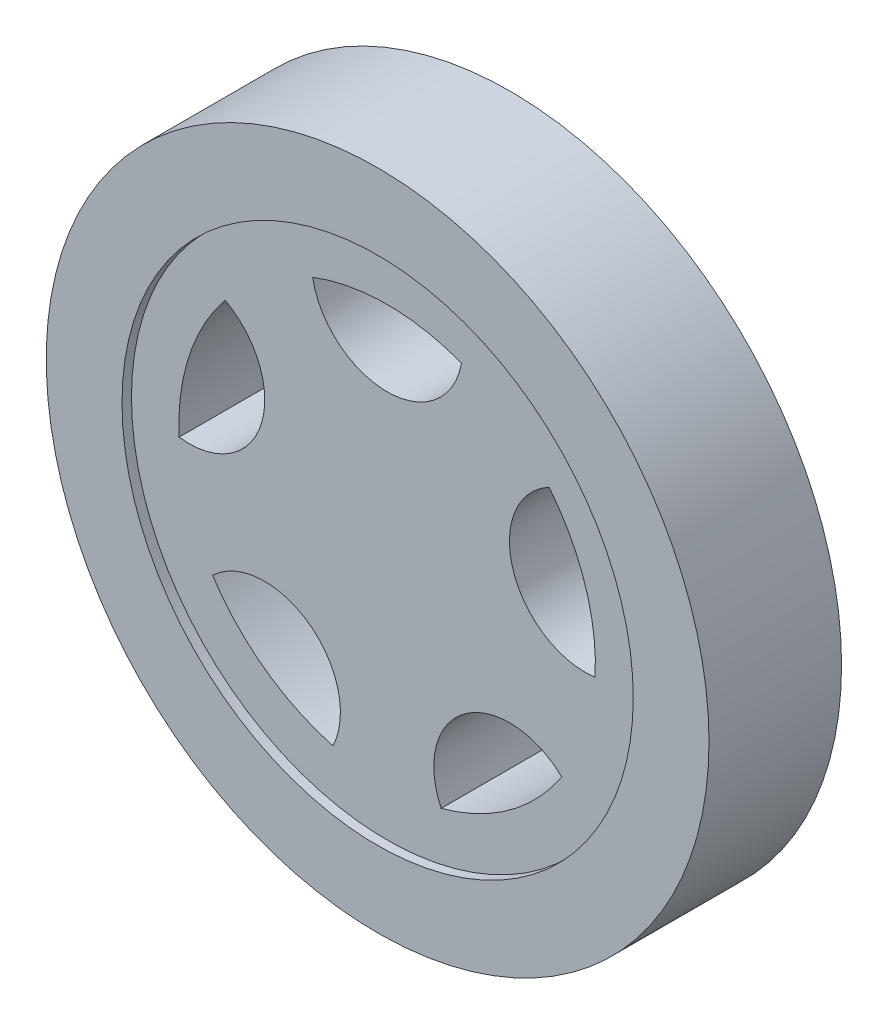
ISO-10303-21;
HEADER;
FILE_DESCRIPTION(('STEP AP214'),'2;1');
FILE_NAME('part.step','',(''),(''),'','','');
FILE_SCHEMA(('AUTOMOTIVE_DESIGN { 1 0 10303 214 1 1 1 1 }'));
ENDSEC;
DATA;
#1=APPLICATION_CONTEXT('core data for automotive mechanical design processes');
#2=APPLICATION_PROTOCOL_DEFINITION('international standard','automotive_design',2000,#1);
#3=PRODUCT_CONTEXT('',#1,'mechanical');
#4=PRODUCT('Part','Part','',(#3));
#5=PRODUCT_RELATED_PRODUCT_CATEGORY('part','',(#4));
#6=PRODUCT_DEFINITION_FORMATION('','',#4);
#7=PRODUCT_DEFINITION_CONTEXT('part definition',#1,'design');
#8=PRODUCT_DEFINITION('design','',#6,#7);
#9=PRODUCT_DEFINITION_SHAPE('','',#8);
#10=(LENGTH_UNIT() NAMED_UNIT(*) SI_UNIT(.MILLI.,.METRE.));
#11=(NAMED_UNIT(*) PLANE_ANGLE_UNIT() SI_UNIT($,.RADIAN.));
#12=(NAMED_UNIT(*) SI_UNIT($,.STERADIAN.) SOLID_ANGLE_UNIT());
#13=UNCERTAINTY_MEASURE_WITH_UNIT(LENGTH_MEASURE(1.E-05),#10,'distance_accuracy_value','');
#14=(GEOMETRIC_REPRESENTATION_CONTEXT(3) GLOBAL_UNCERTAINTY_ASSIGNED_CONTEXT((#13)) GLOBAL_UNIT_ASSIGNED_CONTEXT((#10,
#11,#12)) REPRESENTATION_CONTEXT('',''));
#15=CARTESIAN_POINT('',(0.,0.,0.));
#16=DIRECTION('',(0.,0.,1.));
#17=DIRECTION('',(1.,0.,0.));
#18=AXIS2_PLACEMENT_3D('',#15,#16,#17);
#19=CARTESIAN_POINT('',(104.616216792466,33.9918693812454,-35.));
#20=DIRECTION('',(0.,0.,1.));
#21=DIRECTION('',(1.,0.,0.));
#22=AXIS2_PLACEMENT_3D('',#19,#20,#21);
#23=CYLINDRICAL_SURFACE('',#22,40.);
#24=CARTESIAN_POINT('',(104.616216792466,33.9918693812454,-30.));
#25=DIRECTION('',(0.,0.,-1.));
#26=DIRECTION('',(-1.,0.,0.));
#27=AXIS2_PLACEMENT_3D('',#24,#25,#26);
#28=CIRCLE('',#27,40.);
#29=CARTESIAN_POINT('',(85.5447881116806,69.1526516261499,-30.));
#30=VERTEX_POINT('',#29);
#31=CARTESIAN_POINT('',(109.854096145324,-5.66370550911532,-30.));
#32=VERTEX_POINT('',#31);
#33=EDGE_CURVE('E47',#30,#32,#28,.F.);
#34=ORIENTED_EDGE('',*,*,#33,.F.);
#35=DIRECTION('',(0.,0.,1.));
#36=VECTOR('',#35,1.);
#37=CARTESIAN_POINT('',(85.5447881116806,69.1526516261499,-35.));
#38=LINE('',#37,#36);
#39=CARTESIAN_POINT('',(85.5447881116806,69.1526516261499,30.));
#40=VERTEX_POINT('',#39);
#41=EDGE_CURVE('E149',#30,#40,#38,.T.);
#42=ORIENTED_EDGE('',*,*,#41,.T.);
#43=CARTESIAN_POINT('',(104.616216792466,33.9918693812454,30.));
#44=DIRECTION('',(0.,0.,1.));
#45=DIRECTION('',(1.,0.,0.));
#46=AXIS2_PLACEMENT_3D('',#43,#44,#45);
#47=CIRCLE('',#46,40.);
#48=CARTESIAN_POINT('',(109.854096145324,-5.66370550911532,30.));
#49=VERTEX_POINT('',#48);
#50=EDGE_CURVE('E135',#49,#40,#47,.F.);
#51=ORIENTED_EDGE('',*,*,#50,.F.);
#52=DIRECTION('',(0.,0.,1.));
#53=VECTOR('',#52,1.);
#54=CARTESIAN_POINT('',(109.854096145324,-5.66370550911532,-35.));
#55=LINE('',#54,#53);
#56=EDGE_CURVE('E151',#32,#49,#55,.T.);
#57=ORIENTED_EDGE('',*,*,#56,.F.);
#58=EDGE_LOOP('',(#34,#42,#51,#57));
#59=FACE_BOUND('',#58,.T.);
#60=ADVANCED_FACE('F33',(#59),#23,.F.);
#61=CARTESIAN_POINT('',(0.,0.,-35.));
#62=DIRECTION('',(0.,0.,1.));
#63=DIRECTION('',(1.,0.,0.));
#64=AXIS2_PLACEMENT_3D('',#61,#62,#63);
#65=CYLINDRICAL_SURFACE('',#64,110.);
#66=CARTESIAN_POINT('',(0.,0.,-30.));
#67=DIRECTION('',(0.,0.,-1.));
#68=DIRECTION('',(-1.,0.,0.));
#69=AXIS2_PLACEMENT_3D('',#66,#67,#68);
#70=CIRCLE('',#69,110.);
#71=EDGE_CURVE('E193',#32,#30,#70,.F.);
#72=ORIENTED_EDGE('',*,*,#71,.F.);
#73=ORIENTED_EDGE('',*,*,#56,.T.);
#74=CARTESIAN_POINT('',(0.,0.,30.));
#75=DIRECTION('',(0.,0.,1.));
#76=DIRECTION('',(1.,0.,0.));
#77=AXIS2_PLACEMENT_3D('',#74,#75,#76);
#78=CIRCLE('',#77,110.);
#79=EDGE_CURVE('E182',#40,#49,#78,.F.);
#80=ORIENTED_EDGE('',*,*,#79,.F.);
#81=ORIENTED_EDGE('',*,*,#41,.F.);
#82=EDGE_LOOP('',(#72,#73,#80,#81));
#83=FACE_BOUND('',#82,.T.);
#84=ADVANCED_FACE('F192',(#83),#65,.F.);
#85=CARTESIAN_POINT('',(64.6563777521728,-88.9918693812437,-35.));
#86=DIRECTION('',(0.,0.,1.));
#87=DIRECTION('',(1.,0.,0.));
#88=AXIS2_PLACEMENT_3D('',#85,#86,#87);
#89=CYLINDRICAL_SURFACE('',#88,40.);
#90=CARTESIAN_POINT('',(64.6563777521728,-88.9918693812437,-30.));
#91=DIRECTION('',(0.,0.,-1.));
#92=DIRECTION('',(-1.,0.,0.));
#93=AXIS2_PLACEMENT_3D('',#90,#91,#92);
#94=CIRCLE('',#93,40.);
#95=CARTESIAN_POINT('',(92.2028732548524,-59.9885836101306,-30.));
#96=VERTEX_POINT('',#95);
#97=CARTESIAN_POINT('',(28.5602785797844,-106.227635234176,-30.));
#98=VERTEX_POINT('',#97);
#99=EDGE_CURVE('E54',#96,#98,#94,.F.);
#100=ORIENTED_EDGE('',*,*,#99,.F.);
#101=DIRECTION('',(0.,0.,1.));
#102=VECTOR('',#101,1.);
#103=CARTESIAN_POINT('',(92.2028732548524,-59.9885836101306,-35.));
#104=LINE('',#103,#102);
#105=CARTESIAN_POINT('',(92.2028732548524,-59.9885836101306,30.));
#106=VERTEX_POINT('',#105);
#107=EDGE_CURVE('E145',#96,#106,#104,.T.);
#108=ORIENTED_EDGE('',*,*,#107,.T.);
#109=CARTESIAN_POINT('',(64.6563777521728,-88.9918693812437,30.));
#110=DIRECTION('',(0.,0.,1.));
#111=DIRECTION('',(1.,0.,0.));
#112=AXIS2_PLACEMENT_3D('',#109,#110,#111);
#113=CIRCLE('',#112,40.);
#114=CARTESIAN_POINT('',(28.5602785797844,-106.227635234176,30.));
#115=VERTEX_POINT('',#114);
#116=EDGE_CURVE('E180',#115,#106,#113,.F.);
#117=ORIENTED_EDGE('',*,*,#116,.F.);
#118=DIRECTION('',(0.,0.,1.));
#119=VECTOR('',#118,1.);
#120=CARTESIAN_POINT('',(28.5602785797844,-106.227635234176,-35.));
#121=LINE('',#120,#119);
#122=EDGE_CURVE('E147',#98,#115,#121,.T.);
#123=ORIENTED_EDGE('',*,*,#122,.F.);
#124=EDGE_LOOP('',(#100,#108,#117,#123));
#125=FACE_BOUND('',#124,.T.);
#126=ADVANCED_FACE('F267',(#125),#89,.F.);
#127=CARTESIAN_POINT('',(0.,0.,-35.));
#128=DIRECTION('',(0.,0.,1.));
#129=DIRECTION('',(1.,0.,0.));
#130=AXIS2_PLACEMENT_3D('',#127,#128,#129);
#131=CYLINDRICAL_SURFACE('',#130,110.);
#132=CARTESIAN_POINT('',(0.,0.,-30.));
#133=DIRECTION('',(0.,0.,-1.));
#134=DIRECTION('',(-1.,0.,0.));
#135=AXIS2_PLACEMENT_3D('',#132,#133,#134);
#136=CIRCLE('',#135,110.);
#137=EDGE_CURVE('E199',#98,#96,#136,.F.);
#138=ORIENTED_EDGE('',*,*,#137,.F.);
#139=ORIENTED_EDGE('',*,*,#122,.T.);
#140=CARTESIAN_POINT('',(0.,0.,30.));
#141=DIRECTION('',(0.,0.,1.));
#142=DIRECTION('',(1.,0.,0.));
#143=AXIS2_PLACEMENT_3D('',#140,#141,#142);
#144=CIRCLE('',#143,110.);
#145=EDGE_CURVE('E177',#106,#115,#144,.F.);
#146=ORIENTED_EDGE('',*,*,#145,.F.);
#147=ORIENTED_EDGE('',*,*,#107,.F.);
#148=EDGE_LOOP('',(#138,#139,#146,#147));
#149=FACE_BOUND('',#148,.T.);
#150=ADVANCED_FACE('F272',(#149),#131,.F.);
#151=CARTESIAN_POINT('',(-64.6563777521716,-88.9918693812446,-35.));
#152=DIRECTION('',(0.,0.,1.));
#153=DIRECTION('',(1.,0.,0.));
#154=AXIS2_PLACEMENT_3D('',#151,#152,#153);
#155=CYLINDRICAL_SURFACE('',#154,40.);
#156=CARTESIAN_POINT('',(-64.6563777521716,-88.9918693812446,-30.));
#157=DIRECTION('',(0.,0.,-1.));
#158=DIRECTION('',(-1.,0.,0.));
#159=AXIS2_PLACEMENT_3D('',#156,#157,#158);
#160=CIRCLE('',#159,40.);
#161=CARTESIAN_POINT('',(-28.5602785797829,-106.227635234176,-30.));
#162=VERTEX_POINT('',#161);
#163=CARTESIAN_POINT('',(-92.2028732548516,-59.9885836101318,-30.));
#164=VERTEX_POINT('',#163);
#165=EDGE_CURVE('E201',#162,#164,#160,.F.);
#166=ORIENTED_EDGE('',*,*,#165,.F.);
#167=DIRECTION('',(0.,0.,1.));
#168=VECTOR('',#167,1.);
#169=CARTESIAN_POINT('',(-28.5602785797829,-106.227635234176,-35.));
#170=LINE('',#169,#168);
#171=CARTESIAN_POINT('',(-28.5602785797829,-106.227635234176,30.));
#172=VERTEX_POINT('',#171);
#173=EDGE_CURVE('E141',#162,#172,#170,.T.);
#174=ORIENTED_EDGE('',*,*,#173,.T.);
#175=CARTESIAN_POINT('',(-64.6563777521716,-88.9918693812446,30.));
#176=DIRECTION('',(0.,0.,1.));
#177=DIRECTION('',(1.,0.,0.));
#178=AXIS2_PLACEMENT_3D('',#175,#176,#177);
#179=CIRCLE('',#178,40.);
#180=CARTESIAN_POINT('',(-92.2028732548516,-59.9885836101318,30.));
#181=VERTEX_POINT('',#180);
#182=EDGE_CURVE('E174',#181,#172,#179,.F.);
#183=ORIENTED_EDGE('',*,*,#182,.F.);
#184=DIRECTION('',(0.,0.,1.));
#185=VECTOR('',#184,1.);
#186=CARTESIAN_POINT('',(-92.2028732548516,-59.9885836101318,-35.));
#187=LINE('',#186,#185);
#188=EDGE_CURVE('E143',#164,#181,#187,.T.);
#189=ORIENTED_EDGE('',*,*,#188,.F.);
#190=EDGE_LOOP('',(#166,#174,#183,#189));
#191=FACE_BOUND('',#190,.T.);
#192=ADVANCED_FACE('F276',(#191),#155,.F.);
#193=CARTESIAN_POINT('',(0.,0.,-35.));
#194=DIRECTION('',(0.,0.,1.));
#195=DIRECTION('',(1.,0.,0.));
#196=AXIS2_PLACEMENT_3D('',#193,#194,#195);
#197=CYLINDRICAL_SURFACE('',#196,110.);
#198=CARTESIAN_POINT('',(0.,0.,-30.));
#199=DIRECTION('',(0.,0.,-1.));
#200=DIRECTION('',(-1.,0.,0.));
#201=AXIS2_PLACEMENT_3D('',#198,#199,#200);
#202=CIRCLE('',#201,110.);
#203=EDGE_CURVE('E203',#164,#162,#202,.F.);
#204=ORIENTED_EDGE('',*,*,#203,.F.);
#205=ORIENTED_EDGE('',*,*,#188,.T.);
#206=CARTESIAN_POINT('',(0.,0.,30.));
#207=DIRECTION('',(0.,0.,1.));
#208=DIRECTION('',(1.,0.,0.));
#209=AXIS2_PLACEMENT_3D('',#206,#207,#208);
#210=CIRCLE('',#209,110.);
#211=EDGE_CURVE('E171',#172,#181,#210,.F.);
#212=ORIENTED_EDGE('',*,*,#211,.F.);
#213=ORIENTED_EDGE('',*,*,#173,.F.);
#214=EDGE_LOOP('',(#204,#205,#212,#213));
#215=FACE_BOUND('',#214,.T.);
#216=ADVANCED_FACE('F280',(#215),#197,.F.);
#217=CARTESIAN_POINT('',(-104.616216792467,33.9918693812442,-35.));
#218=DIRECTION('',(0.,0.,1.));
#219=DIRECTION('',(1.,0.,0.));
#220=AXIS2_PLACEMENT_3D('',#217,#218,#219);
#221=CYLINDRICAL_SURFACE('',#220,40.);
#222=CARTESIAN_POINT('',(-104.616216792467,33.9918693812442,-30.));
#223=DIRECTION('',(0.,0.,-1.));
#224=DIRECTION('',(-1.,0.,0.));
#225=AXIS2_PLACEMENT_3D('',#222,#223,#224);
#226=CIRCLE('',#225,40.);
#227=CARTESIAN_POINT('',(-109.854096145324,-5.66370550911533,-30.));
#228=VERTEX_POINT('',#227);
#229=CARTESIAN_POINT('',(-85.5447881116806,69.15265162615,-30.));
#230=VERTEX_POINT('',#229);
#231=EDGE_CURVE('E205',#228,#230,#226,.F.);
#232=ORIENTED_EDGE('',*,*,#231,.F.);
#233=DIRECTION('',(0.,0.,1.));
#234=VECTOR('',#233,1.);
#235=CARTESIAN_POINT('',(-109.854096145324,-5.66370550911533,-35.));
#236=LINE('',#235,#234);
#237=CARTESIAN_POINT('',(-109.854096145324,-5.66370550911533,30.));
#238=VERTEX_POINT('',#237);
#239=EDGE_CURVE('E132',#228,#238,#236,.T.);
#240=ORIENTED_EDGE('',*,*,#239,.T.);
#241=CARTESIAN_POINT('',(-104.616216792467,33.9918693812442,30.));
#242=DIRECTION('',(0.,0.,1.));
#243=DIRECTION('',(1.,0.,0.));
#244=AXIS2_PLACEMENT_3D('',#241,#242,#243);
#245=CIRCLE('',#244,40.);
#246=CARTESIAN_POINT('',(-85.5447881116806,69.15265162615,30.));
#247=VERTEX_POINT('',#246);
#248=EDGE_CURVE('E162',#247,#238,#245,.F.);
#249=ORIENTED_EDGE('',*,*,#248,.F.);
#250=DIRECTION('',(0.,0.,1.));
#251=VECTOR('',#250,1.);
#252=CARTESIAN_POINT('',(-85.5447881116806,69.15265162615,-35.));
#253=LINE('',#252,#251);
#254=EDGE_CURVE('E139',#230,#247,#253,.T.);
#255=ORIENTED_EDGE('',*,*,#254,.F.);
#256=EDGE_LOOP('',(#232,#240,#249,#255));
#257=FACE_BOUND('',#256,.T.);
#258=ADVANCED_FACE('F284',(#257),#221,.F.);
#259=CARTESIAN_POINT('',(0.,0.,-35.));
#260=DIRECTION('',(0.,0.,1.));
#261=DIRECTION('',(1.,0.,0.));
#262=AXIS2_PLACEMENT_3D('',#259,#260,#261);
#263=CYLINDRICAL_SURFACE('',#262,110.);
#264=CARTESIAN_POINT('',(0.,0.,-30.));
#265=DIRECTION('',(0.,0.,-1.));
#266=DIRECTION('',(-1.,0.,0.));
#267=AXIS2_PLACEMENT_3D('',#264,#265,#266);
#268=CIRCLE('',#267,110.);
#269=EDGE_CURVE('E121',#230,#228,#268,.F.);
#270=ORIENTED_EDGE('',*,*,#269,.F.);
#271=ORIENTED_EDGE('',*,*,#254,.T.);
#272=CARTESIAN_POINT('',(0.,0.,30.));
#273=DIRECTION('',(0.,0.,1.));
#274=DIRECTION('',(1.,0.,0.));
#275=AXIS2_PLACEMENT_3D('',#272,#273,#274);
#276=CIRCLE('',#275,110.);
#277=EDGE_CURVE('E158',#238,#247,#276,.F.);
#278=ORIENTED_EDGE('',*,*,#277,.F.);
#279=ORIENTED_EDGE('',*,*,#239,.F.);
#280=EDGE_LOOP('',(#270,#271,#278,#279));
#281=FACE_BOUND('',#280,.T.);
#282=ADVANCED_FACE('F288',(#281),#263,.F.);
#283=CARTESIAN_POINT('',(0.,110.,-35.));
#284=DIRECTION('',(0.,0.,1.));
#285=DIRECTION('',(1.,0.,0.));
#286=AXIS2_PLACEMENT_3D('',#283,#284,#285);
#287=CYLINDRICAL_SURFACE('',#286,40.);
#288=CARTESIAN_POINT('',(0.,110.,-30.));
#289=DIRECTION('',(0.,0.,-1.));
#290=DIRECTION('',(-1.,0.,0.));
#291=AXIS2_PLACEMENT_3D('',#288,#289,#290);
#292=CIRCLE('',#291,40.);
#293=CARTESIAN_POINT('',(-39.3332866414253,102.727272727273,-30.));
#294=VERTEX_POINT('',#293);
#295=CARTESIAN_POINT('',(39.3332866414253,102.727272727273,-30.));
#296=VERTEX_POINT('',#295);
#297=EDGE_CURVE('E111',#294,#296,#292,.F.);
#298=ORIENTED_EDGE('',*,*,#297,.F.);
#299=DIRECTION('',(0.,0.,1.));
#300=VECTOR('',#299,1.);
#301=CARTESIAN_POINT('',(-39.3332866414253,102.727272727273,-35.));
#302=LINE('',#301,#300);
#303=CARTESIAN_POINT('',(-39.3332866414253,102.727272727273,30.));
#304=VERTEX_POINT('',#303);
#305=EDGE_CURVE('E118',#294,#304,#302,.T.);
#306=ORIENTED_EDGE('',*,*,#305,.T.);
#307=CARTESIAN_POINT('',(0.,110.,30.));
#308=DIRECTION('',(0.,0.,1.));
#309=DIRECTION('',(1.,0.,0.));
#310=AXIS2_PLACEMENT_3D('',#307,#308,#309);
#311=CIRCLE('',#310,40.);
#312=CARTESIAN_POINT('',(39.3332866414253,102.727272727273,30.));
#313=VERTEX_POINT('',#312);
#314=EDGE_CURVE('E157',#313,#304,#311,.F.);
#315=ORIENTED_EDGE('',*,*,#314,.F.);
#316=DIRECTION('',(0.,0.,1.));
#317=VECTOR('',#316,1.);
#318=CARTESIAN_POINT('',(39.3332866414253,102.727272727273,-35.));
#319=LINE('',#318,#317);
#320=EDGE_CURVE('E120',#296,#313,#319,.T.);
#321=ORIENTED_EDGE('',*,*,#320,.F.);
#322=EDGE_LOOP('',(#298,#306,#315,#321));
#323=FACE_BOUND('',#322,.T.);
#324=ADVANCED_FACE('F116',(#323),#287,.F.);
#325=CARTESIAN_POINT('',(0.,0.,-35.));
#326=DIRECTION('',(0.,0.,1.));
#327=DIRECTION('',(1.,0.,0.));
#328=AXIS2_PLACEMENT_3D('',#325,#326,#327);
#329=CYLINDRICAL_SURFACE('',#328,110.);
#330=CARTESIAN_POINT('',(0.,0.,-30.));
#331=DIRECTION('',(0.,0.,-1.));
#332=DIRECTION('',(-1.,0.,0.));
#333=AXIS2_PLACEMENT_3D('',#330,#331,#332);
#334=CIRCLE('',#333,110.);
#335=EDGE_CURVE('E11',#296,#294,#334,.F.);
#336=ORIENTED_EDGE('',*,*,#335,.F.);
#337=ORIENTED_EDGE('',*,*,#320,.T.);
#338=CARTESIAN_POINT('',(0.,0.,30.));
#339=DIRECTION('',(0.,0.,1.));
#340=DIRECTION('',(1.,0.,0.));
#341=AXIS2_PLACEMENT_3D('',#338,#339,#340);
#342=CIRCLE('',#341,110.);
#343=EDGE_CURVE('E41',#304,#313,#342,.F.);
#344=ORIENTED_EDGE('',*,*,#343,.F.);
#345=ORIENTED_EDGE('',*,*,#305,.F.);
#346=EDGE_LOOP('',(#336,#337,#344,#345));
#347=FACE_BOUND('',#346,.T.);
#348=ADVANCED_FACE('F125',(#347),#329,.F.);
#349=CARTESIAN_POINT('',(0.,0.,-35.));
#350=DIRECTION('',(0.,0.,1.));
#351=DIRECTION('',(1.,0.,0.));
#352=AXIS2_PLACEMENT_3D('',#349,#350,#351);
#353=CYLINDRICAL_SURFACE('',#352,175.);
#354=CARTESIAN_POINT('',(0.,0.,-35.));
#355=DIRECTION('',(0.,0.,1.));
#356=DIRECTION('',(1.,0.,0.));
#357=AXIS2_PLACEMENT_3D('',#354,#355,#356);
#358=CIRCLE('',#357,175.);
#359=CARTESIAN_POINT('',(175.,0.,-35.));
#360=VERTEX_POINT('',#359);
#361=EDGE_CURVE('E130',#360,#360,#358,.T.);
#362=ORIENTED_EDGE('',*,*,#361,.T.);
#363=EDGE_LOOP('',(#362));
#364=FACE_BOUND('',#363,.T.);
#365=CARTESIAN_POINT('',(0.,0.,35.));
#366=DIRECTION('',(0.,0.,1.));
#367=DIRECTION('',(1.,0.,0.));
#368=AXIS2_PLACEMENT_3D('',#365,#366,#367);
#369=CIRCLE('',#368,175.);
#370=CARTESIAN_POINT('',(175.,0.,35.));
#371=VERTEX_POINT('',#370);
#372=EDGE_CURVE('E127',#371,#371,#369,.T.);
#373=ORIENTED_EDGE('',*,*,#372,.F.);
#374=EDGE_LOOP('',(#373));
#375=FACE_BOUND('',#374,.T.);
#376=ADVANCED_FACE('F35',(#364,#375),#353,.T.);
#377=CARTESIAN_POINT('',(0.,0.,-35.));
#378=DIRECTION('',(0.,0.,1.));
#379=DIRECTION('',(1.,0.,0.));
#380=AXIS2_PLACEMENT_3D('',#377,#378,#379);
#381=PLANE('',#380);
#382=CARTESIAN_POINT('',(0.,0.,-35.));
#383=DIRECTION('',(0.,0.,1.));
#384=DIRECTION('',(1.,0.,0.));
#385=AXIS2_PLACEMENT_3D('',#382,#383,#384);
#386=CIRCLE('',#385,135.);
#387=CARTESIAN_POINT('',(135.,0.,-35.));
#388=VERTEX_POINT('',#387);
#389=EDGE_CURVE('E208',#388,#388,#386,.T.);
#390=ORIENTED_EDGE('',*,*,#389,.T.);
#391=EDGE_LOOP('',(#390));
#392=FACE_BOUND('',#391,.T.);
#393=ORIENTED_EDGE('',*,*,#361,.F.);
#394=EDGE_LOOP('',(#393));
#395=FACE_BOUND('',#394,.T.);
#396=ADVANCED_FACE('F243',(#392,#395),#381,.F.);
#397=CARTESIAN_POINT('',(0.,0.,35.));
#398=DIRECTION('',(0.,0.,1.));
#399=DIRECTION('',(1.,0.,0.));
#400=AXIS2_PLACEMENT_3D('',#397,#398,#399);
#401=PLANE('',#400);
#402=CARTESIAN_POINT('',(0.,0.,35.));
#403=DIRECTION('',(0.,0.,1.));
#404=DIRECTION('',(1.,0.,0.));
#405=AXIS2_PLACEMENT_3D('',#402,#403,#404);
#406=CIRCLE('',#405,135.);
#407=CARTESIAN_POINT('',(135.,0.,35.));
#408=VERTEX_POINT('',#407);
#409=EDGE_CURVE('E165',#408,#408,#406,.T.);
#410=ORIENTED_EDGE('',*,*,#409,.F.);
#411=EDGE_LOOP('',(#410));
#412=FACE_BOUND('',#411,.T.);
#413=ORIENTED_EDGE('',*,*,#372,.T.);
#414=EDGE_LOOP('',(#413));
#415=FACE_BOUND('',#414,.T.);
#416=ADVANCED_FACE('F246',(#412,#415),#401,.T.);
#417=CARTESIAN_POINT('',(0.,0.,30.));
#418=DIRECTION('',(0.,0.,1.));
#419=DIRECTION('',(1.,0.,0.));
#420=AXIS2_PLACEMENT_3D('',#417,#418,#419);
#421=PLANE('',#420);
#422=ORIENTED_EDGE('',*,*,#116,.T.);
#423=ORIENTED_EDGE('',*,*,#145,.T.);
#424=EDGE_LOOP('',(#422,#423));
#425=FACE_BOUND('',#424,.T.);
#426=ORIENTED_EDGE('',*,*,#248,.T.);
#427=ORIENTED_EDGE('',*,*,#277,.T.);
#428=EDGE_LOOP('',(#426,#427));
#429=FACE_BOUND('',#428,.T.);
#430=CARTESIAN_POINT('',(0.,0.,30.));
#431=DIRECTION('',(0.,0.,1.));
#432=DIRECTION('',(1.,0.,0.));
#433=AXIS2_PLACEMENT_3D('',#430,#431,#432);
#434=CIRCLE('',#433,135.);
#435=CARTESIAN_POINT('',(135.,0.,30.));
#436=VERTEX_POINT('',#435);
#437=EDGE_CURVE('E159',#436,#436,#434,.T.);
#438=ORIENTED_EDGE('',*,*,#437,.T.);
#439=EDGE_LOOP('',(#438));
#440=FACE_BOUND('',#439,.T.);
#441=ORIENTED_EDGE('',*,*,#314,.T.);
#442=ORIENTED_EDGE('',*,*,#343,.T.);
#443=EDGE_LOOP('',(#441,#442));
#444=FACE_BOUND('',#443,.T.);
#445=ORIENTED_EDGE('',*,*,#182,.T.);
#446=ORIENTED_EDGE('',*,*,#211,.T.);
#447=EDGE_LOOP('',(#445,#446));
#448=FACE_BOUND('',#447,.T.);
#449=ORIENTED_EDGE('',*,*,#50,.T.);
#450=ORIENTED_EDGE('',*,*,#79,.T.);
#451=EDGE_LOOP('',(#449,#450));
#452=FACE_BOUND('',#451,.T.);
#453=ADVANCED_FACE('F155',(#425,#429,#440,#444,#448,#452),#421,.T.);
#454=CARTESIAN_POINT('',(0.,0.,30.));
#455=DIRECTION('',(0.,0.,1.));
#456=DIRECTION('',(1.,0.,0.));
#457=AXIS2_PLACEMENT_3D('',#454,#455,#456);
#458=CYLINDRICAL_SURFACE('',#457,135.);
#459=ORIENTED_EDGE('',*,*,#437,.F.);
#460=EDGE_LOOP('',(#459));
#461=FACE_BOUND('',#460,.T.);
#462=ORIENTED_EDGE('',*,*,#409,.T.);
#463=EDGE_LOOP('',(#462));
#464=FACE_BOUND('',#463,.T.);
#465=ADVANCED_FACE('F230',(#461,#464),#458,.F.);
#466=CARTESIAN_POINT('',(0.,0.,-30.));
#467=DIRECTION('',(0.,0.,-1.));
#468=DIRECTION('',(1.,0.,0.));
#469=AXIS2_PLACEMENT_3D('',#466,#467,#468);
#470=PLANE('',#469);
#471=CARTESIAN_POINT('',(0.,0.,-30.));
#472=DIRECTION('',(0.,0.,-1.));
#473=DIRECTION('',(-1.,0.,0.));
#474=AXIS2_PLACEMENT_3D('',#471,#472,#473);
#475=CIRCLE('',#474,10.);
#476=CARTESIAN_POINT('',(-10.,0.,-30.));
#477=VERTEX_POINT('',#476);
#478=EDGE_CURVE('E214',#477,#477,#475,.T.);
#479=ORIENTED_EDGE('',*,*,#478,.F.);
#480=EDGE_LOOP('',(#479));
#481=FACE_BOUND('',#480,.T.);
#482=ORIENTED_EDGE('',*,*,#99,.T.);
#483=ORIENTED_EDGE('',*,*,#137,.T.);
#484=EDGE_LOOP('',(#482,#483));
#485=FACE_BOUND('',#484,.T.);
#486=ORIENTED_EDGE('',*,*,#231,.T.);
#487=ORIENTED_EDGE('',*,*,#269,.T.);
#488=EDGE_LOOP('',(#486,#487));
#489=FACE_BOUND('',#488,.T.);
#490=CARTESIAN_POINT('',(0.,0.,-30.));
#491=DIRECTION('',(0.,0.,1.));
#492=DIRECTION('',(1.,0.,0.));
#493=AXIS2_PLACEMENT_3D('',#490,#491,#492);
#494=CIRCLE('',#493,135.);
#495=CARTESIAN_POINT('',(135.,0.,-30.));
#496=VERTEX_POINT('',#495);
#497=EDGE_CURVE('E122',#496,#496,#494,.T.);
#498=ORIENTED_EDGE('',*,*,#497,.F.);
#499=EDGE_LOOP('',(#498));
#500=FACE_BOUND('',#499,.T.);
#501=ORIENTED_EDGE('',*,*,#297,.T.);
#502=ORIENTED_EDGE('',*,*,#335,.T.);
#503=EDGE_LOOP('',(#501,#502));
#504=FACE_BOUND('',#503,.T.);
#505=ORIENTED_EDGE('',*,*,#165,.T.);
#506=ORIENTED_EDGE('',*,*,#203,.T.);
#507=EDGE_LOOP('',(#505,#506));
#508=FACE_BOUND('',#507,.T.);
#509=ORIENTED_EDGE('',*,*,#33,.T.);
#510=ORIENTED_EDGE('',*,*,#71,.T.);
#511=EDGE_LOOP('',(#509,#510));
#512=FACE_BOUND('',#511,.T.);
#513=ADVANCED_FACE('F109',(#481,#485,#489,#500,#504,#508,#512),#470,.T.);
#514=CARTESIAN_POINT('',(0.,0.,-30.));
#515=DIRECTION('',(0.,0.,-1.));
#516=DIRECTION('',(-1.,0.,0.));
#517=AXIS2_PLACEMENT_3D('',#514,#515,#516);
#518=CYLINDRICAL_SURFACE('',#517,135.);
#519=ORIENTED_EDGE('',*,*,#497,.T.);
#520=EDGE_LOOP('',(#519));
#521=FACE_BOUND('',#520,.T.);
#522=ORIENTED_EDGE('',*,*,#389,.F.);
#523=EDGE_LOOP('',(#522));
#524=FACE_BOUND('',#523,.T.);
#525=ADVANCED_FACE('F225',(#521,#524),#518,.F.);
#526=CARTESIAN_POINT('',(0.,0.,0.));
#527=DIRECTION('',(0.,0.,-1.));
#528=DIRECTION('',(-1.,0.,0.));
#529=AXIS2_PLACEMENT_3D('',#526,#527,#528);
#530=CYLINDRICAL_SURFACE('',#529,10.);
#531=CARTESIAN_POINT('',(0.,0.,0.));
#532=DIRECTION('',(0.,0.,-1.));
#533=DIRECTION('',(-1.,0.,0.));
#534=AXIS2_PLACEMENT_3D('',#531,#532,#533);
#535=CIRCLE('',#534,10.);
#536=CARTESIAN_POINT('',(-10.,0.,0.));
#537=VERTEX_POINT('',#536);
#538=EDGE_CURVE('E211',#537,#537,#535,.T.);
#539=ORIENTED_EDGE('',*,*,#538,.F.);
#540=EDGE_LOOP('',(#539));
#541=FACE_BOUND('',#540,.T.);
#542=ORIENTED_EDGE('',*,*,#478,.T.);
#543=EDGE_LOOP('',(#542));
#544=FACE_BOUND('',#543,.T.);
#545=ADVANCED_FACE('F222',(#541,#544),#530,.F.);
#546=CARTESIAN_POINT('',(0.,0.,0.));
#547=DIRECTION('',(0.,0.,-1.));
#548=DIRECTION('',(-1.,0.,0.));
#549=AXIS2_PLACEMENT_3D('',#546,#547,#548);
#550=PLANE('',#549);
#551=ORIENTED_EDGE('',*,*,#538,.T.);
#552=EDGE_LOOP('',(#551));
#553=FACE_BOUND('',#552,.T.);
#554=ADVANCED_FACE('F220',(#553),#550,.T.);
#555=CLOSED_SHELL('',(#60,#84,#126,#150,#192,#216,#258,#282,#324,#348,#376,#396,#416,#453,#465,
#513,#525,#545,#554));
#556=MANIFOLD_SOLID_BREP('B2',#555);
#557=ADVANCED_BREP_SHAPE_REPRESENTATION('',(#18,#556),#14);
#558=SHAPE_DEFINITION_REPRESENTATION(#9,#557);
ENDSEC;
END-ISO-10303-21;
